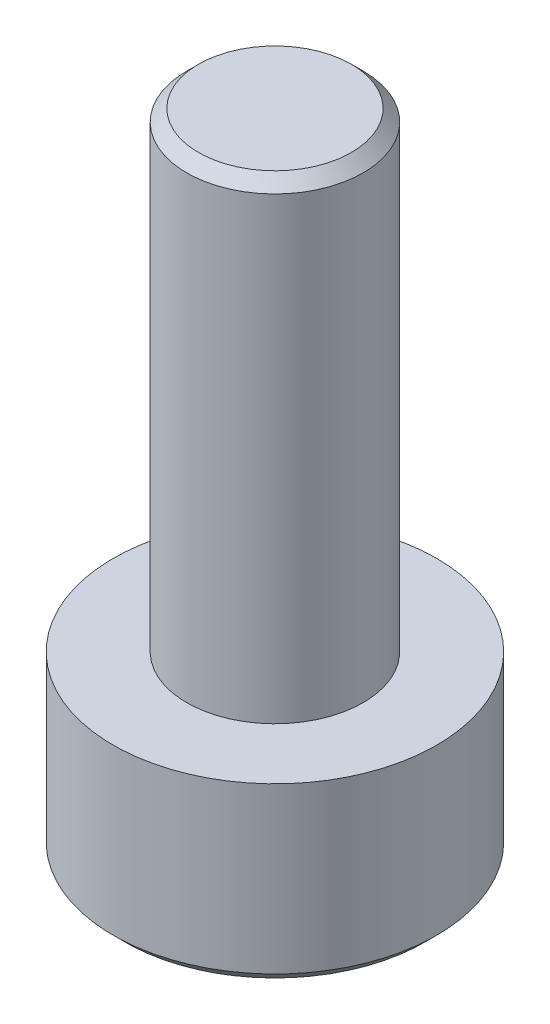
ISO-10303-21;
HEADER;
FILE_DESCRIPTION(('STEP AP214'),'2;1');
FILE_NAME('part.step','',(''),(''),'','','');
FILE_SCHEMA(('AUTOMOTIVE_DESIGN { 1 0 10303 214 1 1 1 1 }'));
ENDSEC;
DATA;
#1=APPLICATION_CONTEXT('core data for automotive mechanical design processes');
#2=APPLICATION_PROTOCOL_DEFINITION('international standard','automotive_design',2000,#1);
#3=PRODUCT_CONTEXT('',#1,'mechanical');
#4=PRODUCT('Part','Part','',(#3));
#5=PRODUCT_RELATED_PRODUCT_CATEGORY('part','',(#4));
#6=PRODUCT_DEFINITION_FORMATION('','',#4);
#7=PRODUCT_DEFINITION_CONTEXT('part definition',#1,'design');
#8=PRODUCT_DEFINITION('design','',#6,#7);
#9=PRODUCT_DEFINITION_SHAPE('','',#8);
#10=(LENGTH_UNIT() NAMED_UNIT(*) SI_UNIT(.MILLI.,.METRE.));
#11=(NAMED_UNIT(*) PLANE_ANGLE_UNIT() SI_UNIT($,.RADIAN.));
#12=(NAMED_UNIT(*) SI_UNIT($,.STERADIAN.) SOLID_ANGLE_UNIT());
#13=UNCERTAINTY_MEASURE_WITH_UNIT(LENGTH_MEASURE(1.E-05),#10,'distance_accuracy_value','');
#14=(GEOMETRIC_REPRESENTATION_CONTEXT(3) GLOBAL_UNCERTAINTY_ASSIGNED_CONTEXT((#13)) GLOBAL_UNIT_ASSIGNED_CONTEXT((#10,
#11,#12)) REPRESENTATION_CONTEXT('',''));
#15=CARTESIAN_POINT('',(0.,0.,0.));
#16=DIRECTION('',(0.,0.,1.));
#17=DIRECTION('',(1.,0.,0.));
#18=AXIS2_PLACEMENT_3D('',#15,#16,#17);
#19=CARTESIAN_POINT('',(0.,-3.,0.));
#20=DIRECTION('',(0.,-1.,0.));
#21=DIRECTION('',(0.,0.,-1.));
#22=AXIS2_PLACEMENT_3D('',#19,#20,#21);
#23=PLANE('',#22);
#24=CARTESIAN_POINT('',(0.,-3.,0.));
#25=DIRECTION('',(0.,-1.,0.));
#26=DIRECTION('',(0.,0.,-1.));
#27=AXIS2_PLACEMENT_3D('',#24,#25,#26);
#28=CIRCLE('',#27,2.55);
#29=CARTESIAN_POINT('',(0.,-3.,-2.55));
#30=VERTEX_POINT('',#29);
#31=EDGE_CURVE('E11',#30,#30,#28,.T.);
#32=ORIENTED_EDGE('',*,*,#31,.T.);
#33=EDGE_LOOP('',(#32));
#34=FACE_BOUND('',#33,.T.);
#35=DIRECTION('',(0.5,0.,-0.866025403784439));
#36=VECTOR('',#35,1.);
#37=CARTESIAN_POINT('',(1.44337567297406,-3.,0.));
#38=LINE('',#37,#36);
#39=CARTESIAN_POINT('',(0.721687836487032,-3.,1.25));
#40=VERTEX_POINT('',#39);
#41=CARTESIAN_POINT('',(1.44337567297406,-3.,0.));
#42=VERTEX_POINT('',#41);
#43=EDGE_CURVE('E131',#40,#42,#38,.T.);
#44=ORIENTED_EDGE('',*,*,#43,.T.);
#45=DIRECTION('',(-0.5,0.,-0.866025403784439));
#46=VECTOR('',#45,1.);
#47=CARTESIAN_POINT('',(0.721687836487032,-3.,-1.25));
#48=LINE('',#47,#46);
#49=CARTESIAN_POINT('',(0.721687836487032,-3.,-1.25));
#50=VERTEX_POINT('',#49);
#51=EDGE_CURVE('E51',#42,#50,#48,.T.);
#52=ORIENTED_EDGE('',*,*,#51,.T.);
#53=DIRECTION('',(-1.,0.,0.));
#54=VECTOR('',#53,1.);
#55=CARTESIAN_POINT('',(-0.721687836487033,-3.,-1.25));
#56=LINE('',#55,#54);
#57=CARTESIAN_POINT('',(-0.721687836487033,-3.,-1.25));
#58=VERTEX_POINT('',#57);
#59=EDGE_CURVE('E122',#50,#58,#56,.T.);
#60=ORIENTED_EDGE('',*,*,#59,.T.);
#61=DIRECTION('',(-0.5,0.,0.866025403784439));
#62=VECTOR('',#61,1.);
#63=CARTESIAN_POINT('',(-1.44337567297406,-3.,0.));
#64=LINE('',#63,#62);
#65=CARTESIAN_POINT('',(-1.44337567297406,-3.,0.));
#66=VERTEX_POINT('',#65);
#67=EDGE_CURVE('E125',#58,#66,#64,.T.);
#68=ORIENTED_EDGE('',*,*,#67,.T.);
#69=DIRECTION('',(0.5,0.,0.866025403784439));
#70=VECTOR('',#69,1.);
#71=CARTESIAN_POINT('',(-0.721687836487032,-3.,1.25));
#72=LINE('',#71,#70);
#73=CARTESIAN_POINT('',(-0.721687836487032,-3.,1.25));
#74=VERTEX_POINT('',#73);
#75=EDGE_CURVE('E128',#66,#74,#72,.T.);
#76=ORIENTED_EDGE('',*,*,#75,.T.);
#77=DIRECTION('',(1.,0.,0.));
#78=VECTOR('',#77,1.);
#79=CARTESIAN_POINT('',(0.721687836487032,-3.,1.25));
#80=LINE('',#79,#78);
#81=EDGE_CURVE('E112',#74,#40,#80,.T.);
#82=ORIENTED_EDGE('',*,*,#81,.T.);
#83=EDGE_LOOP('',(#44,#52,#60,#68,#76,#82));
#84=FACE_BOUND('',#83,.T.);
#85=ADVANCED_FACE('F37',(#34,#84),#23,.T.);
#86=CARTESIAN_POINT('',(0.,-3.,0.));
#87=DIRECTION('',(0.,1.,0.));
#88=DIRECTION('',(0.,0.,1.));
#89=AXIS2_PLACEMENT_3D('',#86,#87,#88);
#90=CONICAL_SURFACE('',#89,2.55,0.785398163397504);
#91=CARTESIAN_POINT('',(0.,-2.80000000000002,0.));
#92=DIRECTION('',(0.,-1.,0.));
#93=DIRECTION('',(0.,0.,-1.));
#94=AXIS2_PLACEMENT_3D('',#91,#92,#93);
#95=CIRCLE('',#94,2.75);
#96=CARTESIAN_POINT('',(0.,-2.80000000000002,-2.75));
#97=VERTEX_POINT('',#96);
#98=EDGE_CURVE('E44',#97,#97,#95,.T.);
#99=ORIENTED_EDGE('',*,*,#98,.T.);
#100=EDGE_LOOP('',(#99));
#101=FACE_BOUND('',#100,.T.);
#102=ORIENTED_EDGE('',*,*,#31,.F.);
#103=EDGE_LOOP('',(#102));
#104=FACE_BOUND('',#103,.T.);
#105=ADVANCED_FACE('F156',(#101,#104),#90,.T.);
#106=CARTESIAN_POINT('',(0.,-500.,0.));
#107=DIRECTION('',(0.,-1.,0.));
#108=DIRECTION('',(0.,0.,-1.));
#109=AXIS2_PLACEMENT_3D('',#106,#107,#108);
#110=CYLINDRICAL_SURFACE('',#109,2.75);
#111=CARTESIAN_POINT('',(0.,0.,0.));
#112=DIRECTION('',(0.,-1.,0.));
#113=DIRECTION('',(0.,0.,-1.));
#114=AXIS2_PLACEMENT_3D('',#111,#112,#113);
#115=CIRCLE('',#114,2.75);
#116=CARTESIAN_POINT('',(0.,0.,-2.75));
#117=VERTEX_POINT('',#116);
#118=EDGE_CURVE('E151',#117,#117,#115,.T.);
#119=ORIENTED_EDGE('',*,*,#118,.T.);
#120=EDGE_LOOP('',(#119));
#121=FACE_BOUND('',#120,.T.);
#122=ORIENTED_EDGE('',*,*,#98,.F.);
#123=EDGE_LOOP('',(#122));
#124=FACE_BOUND('',#123,.T.);
#125=ADVANCED_FACE('F159',(#121,#124),#110,.T.);
#126=CARTESIAN_POINT('',(2.75,0.,0.));
#127=DIRECTION('',(0.,1.,0.));
#128=DIRECTION('',(0.,0.,1.));
#129=AXIS2_PLACEMENT_3D('',#126,#127,#128);
#130=PLANE('',#129);
#131=CARTESIAN_POINT('',(0.,0.,0.));
#132=DIRECTION('',(0.,-1.,0.));
#133=DIRECTION('',(0.,0.,-1.));
#134=AXIS2_PLACEMENT_3D('',#131,#132,#133);
#135=CIRCLE('',#134,1.5);
#136=CARTESIAN_POINT('',(0.,0.,-1.5));
#137=VERTEX_POINT('',#136);
#138=EDGE_CURVE('E148',#137,#137,#135,.T.);
#139=ORIENTED_EDGE('',*,*,#138,.T.);
#140=EDGE_LOOP('',(#139));
#141=FACE_BOUND('',#140,.T.);
#142=ORIENTED_EDGE('',*,*,#118,.F.);
#143=EDGE_LOOP('',(#142));
#144=FACE_BOUND('',#143,.T.);
#145=ADVANCED_FACE('F161',(#141,#144),#130,.T.);
#146=CARTESIAN_POINT('',(0.,-500.,0.));
#147=DIRECTION('',(0.,-1.,0.));
#148=DIRECTION('',(0.,0.,-1.));
#149=AXIS2_PLACEMENT_3D('',#146,#147,#148);
#150=CYLINDRICAL_SURFACE('',#149,1.5);
#151=CARTESIAN_POINT('',(0.,7.80000000000003,0.));
#152=DIRECTION('',(0.,-1.,0.));
#153=DIRECTION('',(0.,0.,-1.));
#154=AXIS2_PLACEMENT_3D('',#151,#152,#153);
#155=CIRCLE('',#154,1.5);
#156=CARTESIAN_POINT('',(0.,7.80000000000003,-1.5));
#157=VERTEX_POINT('',#156);
#158=EDGE_CURVE('E145',#157,#157,#155,.T.);
#159=ORIENTED_EDGE('',*,*,#158,.T.);
#160=EDGE_LOOP('',(#159));
#161=FACE_BOUND('',#160,.T.);
#162=ORIENTED_EDGE('',*,*,#138,.F.);
#163=EDGE_LOOP('',(#162));
#164=FACE_BOUND('',#163,.T.);
#165=ADVANCED_FACE('F168',(#161,#164),#150,.T.);
#166=CARTESIAN_POINT('',(0.,7.80000000000003,0.));
#167=DIRECTION('',(0.,-1.,0.));
#168=DIRECTION('',(0.,0.,-1.));
#169=AXIS2_PLACEMENT_3D('',#166,#167,#168);
#170=CONICAL_SURFACE('',#169,1.5,0.785398163397504);
#171=CARTESIAN_POINT('',(0.,8.00000000000001,0.));
#172=DIRECTION('',(0.,-1.,0.));
#173=DIRECTION('',(0.,0.,-1.));
#174=AXIS2_PLACEMENT_3D('',#171,#172,#173);
#175=CIRCLE('',#174,1.3);
#176=CARTESIAN_POINT('',(0.,8.00000000000001,-1.3));
#177=VERTEX_POINT('',#176);
#178=EDGE_CURVE('E142',#177,#177,#175,.T.);
#179=ORIENTED_EDGE('',*,*,#178,.T.);
#180=EDGE_LOOP('',(#179));
#181=FACE_BOUND('',#180,.T.);
#182=ORIENTED_EDGE('',*,*,#158,.F.);
#183=EDGE_LOOP('',(#182));
#184=FACE_BOUND('',#183,.T.);
#185=ADVANCED_FACE('F201',(#181,#184),#170,.T.);
#186=CARTESIAN_POINT('',(1.3,8.,0.));
#187=DIRECTION('',(0.,1.,0.));
#188=DIRECTION('',(0.,0.,1.));
#189=AXIS2_PLACEMENT_3D('',#186,#187,#188);
#190=PLANE('',#189);
#191=ORIENTED_EDGE('',*,*,#178,.F.);
#192=EDGE_LOOP('',(#191));
#193=FACE_BOUND('',#192,.T.);
#194=ADVANCED_FACE('F195',(#193),#190,.T.);
#195=CARTESIAN_POINT('',(0.721687836487032,-1.5,-1.25));
#196=DIRECTION('',(-0.866025403784439,0.,0.5));
#197=DIRECTION('',(0.5,0.,0.866025403784439));
#198=AXIS2_PLACEMENT_3D('',#195,#196,#197);
#199=PLANE('',#198);
#200=ORIENTED_EDGE('',*,*,#51,.F.);
#201=DIRECTION('',(0.,-1.,0.));
#202=VECTOR('',#201,1.);
#203=CARTESIAN_POINT('',(1.44337567297406,-1.5,0.));
#204=LINE('',#203,#202);
#205=CARTESIAN_POINT('',(1.44337567297406,-1.5,0.));
#206=VERTEX_POINT('',#205);
#207=EDGE_CURVE('E117',#206,#42,#204,.T.);
#208=ORIENTED_EDGE('',*,*,#207,.F.);
#209=DIRECTION('',(-0.5,0.,-0.866025403784439));
#210=VECTOR('',#209,1.);
#211=CARTESIAN_POINT('',(0.721687836487032,-1.5,-1.25));
#212=LINE('',#211,#210);
#213=CARTESIAN_POINT('',(0.721687836487032,-1.5,-1.25));
#214=VERTEX_POINT('',#213);
#215=EDGE_CURVE('E134',#206,#214,#212,.T.);
#216=ORIENTED_EDGE('',*,*,#215,.T.);
#217=DIRECTION('',(0.,-1.,0.));
#218=VECTOR('',#217,1.);
#219=CARTESIAN_POINT('',(0.721687836487032,-1.5,-1.25));
#220=LINE('',#219,#218);
#221=EDGE_CURVE('E140',#214,#50,#220,.T.);
#222=ORIENTED_EDGE('',*,*,#221,.T.);
#223=EDGE_LOOP('',(#200,#208,#216,#222));
#224=FACE_BOUND('',#223,.T.);
#225=ADVANCED_FACE('F178',(#224),#199,.T.);
#226=CARTESIAN_POINT('',(-0.721687836487033,-1.5,-1.25));
#227=DIRECTION('',(0.,0.,1.));
#228=DIRECTION('',(1.,0.,0.));
#229=AXIS2_PLACEMENT_3D('',#226,#227,#228);
#230=PLANE('',#229);
#231=ORIENTED_EDGE('',*,*,#59,.F.);
#232=ORIENTED_EDGE('',*,*,#221,.F.);
#233=DIRECTION('',(-1.,0.,0.));
#234=VECTOR('',#233,1.);
#235=CARTESIAN_POINT('',(-0.721687836487033,-1.5,-1.25));
#236=LINE('',#235,#234);
#237=CARTESIAN_POINT('',(-0.721687836487033,-1.5,-1.25));
#238=VERTEX_POINT('',#237);
#239=EDGE_CURVE('E90',#214,#238,#236,.T.);
#240=ORIENTED_EDGE('',*,*,#239,.T.);
#241=DIRECTION('',(0.,-1.,0.));
#242=VECTOR('',#241,1.);
#243=CARTESIAN_POINT('',(-0.721687836487033,-1.5,-1.25));
#244=LINE('',#243,#242);
#245=EDGE_CURVE('E138',#238,#58,#244,.T.);
#246=ORIENTED_EDGE('',*,*,#245,.T.);
#247=EDGE_LOOP('',(#231,#232,#240,#246));
#248=FACE_BOUND('',#247,.T.);
#249=ADVANCED_FACE('F187',(#248),#230,.T.);
#250=CARTESIAN_POINT('',(-1.44337567297406,-1.5,0.));
#251=DIRECTION('',(0.866025403784439,0.,0.5));
#252=DIRECTION('',(0.5,0.,-0.866025403784439));
#253=AXIS2_PLACEMENT_3D('',#250,#251,#252);
#254=PLANE('',#253);
#255=ORIENTED_EDGE('',*,*,#67,.F.);
#256=ORIENTED_EDGE('',*,*,#245,.F.);
#257=DIRECTION('',(-0.5,0.,0.866025403784439));
#258=VECTOR('',#257,1.);
#259=CARTESIAN_POINT('',(-1.44337567297406,-1.5,0.));
#260=LINE('',#259,#258);
#261=CARTESIAN_POINT('',(-1.44337567297406,-1.5,0.));
#262=VERTEX_POINT('',#261);
#263=EDGE_CURVE('E108',#238,#262,#260,.T.);
#264=ORIENTED_EDGE('',*,*,#263,.T.);
#265=DIRECTION('',(0.,-1.,0.));
#266=VECTOR('',#265,1.);
#267=CARTESIAN_POINT('',(-1.44337567297406,-1.5,0.));
#268=LINE('',#267,#266);
#269=EDGE_CURVE('E105',#262,#66,#268,.T.);
#270=ORIENTED_EDGE('',*,*,#269,.T.);
#271=EDGE_LOOP('',(#255,#256,#264,#270));
#272=FACE_BOUND('',#271,.T.);
#273=ADVANCED_FACE('F185',(#272),#254,.T.);
#274=CARTESIAN_POINT('',(-0.721687836487032,-1.5,1.25));
#275=DIRECTION('',(0.866025403784438,0.,-0.5));
#276=DIRECTION('',(-0.5,0.,-0.866025403784439));
#277=AXIS2_PLACEMENT_3D('',#274,#275,#276);
#278=PLANE('',#277);
#279=ORIENTED_EDGE('',*,*,#75,.F.);
#280=ORIENTED_EDGE('',*,*,#269,.F.);
#281=DIRECTION('',(0.5,0.,0.866025403784439));
#282=VECTOR('',#281,1.);
#283=CARTESIAN_POINT('',(-0.721687836487032,-1.5,1.25));
#284=LINE('',#283,#282);
#285=CARTESIAN_POINT('',(-0.721687836487032,-1.5,1.25));
#286=VERTEX_POINT('',#285);
#287=EDGE_CURVE('E100',#262,#286,#284,.T.);
#288=ORIENTED_EDGE('',*,*,#287,.T.);
#289=DIRECTION('',(0.,-1.,0.));
#290=VECTOR('',#289,1.);
#291=CARTESIAN_POINT('',(-0.721687836487032,-1.5,1.25));
#292=LINE('',#291,#290);
#293=EDGE_CURVE('E104',#286,#74,#292,.T.);
#294=ORIENTED_EDGE('',*,*,#293,.T.);
#295=EDGE_LOOP('',(#279,#280,#288,#294));
#296=FACE_BOUND('',#295,.T.);
#297=ADVANCED_FACE('F103',(#296),#278,.T.);
#298=CARTESIAN_POINT('',(0.721687836487032,-1.5,1.25));
#299=DIRECTION('',(0.,0.,-1.));
#300=DIRECTION('',(-1.,0.,0.));
#301=AXIS2_PLACEMENT_3D('',#298,#299,#300);
#302=PLANE('',#301);
#303=ORIENTED_EDGE('',*,*,#81,.F.);
#304=ORIENTED_EDGE('',*,*,#293,.F.);
#305=DIRECTION('',(1.,0.,0.));
#306=VECTOR('',#305,1.);
#307=CARTESIAN_POINT('',(0.721687836487032,-1.5,1.25));
#308=LINE('',#307,#306);
#309=CARTESIAN_POINT('',(0.721687836487032,-1.5,1.25));
#310=VERTEX_POINT('',#309);
#311=EDGE_CURVE('E107',#286,#310,#308,.T.);
#312=ORIENTED_EDGE('',*,*,#311,.T.);
#313=DIRECTION('',(0.,-1.,0.));
#314=VECTOR('',#313,1.);
#315=CARTESIAN_POINT('',(0.721687836487032,-1.5,1.25));
#316=LINE('',#315,#314);
#317=EDGE_CURVE('E81',#310,#40,#316,.T.);
#318=ORIENTED_EDGE('',*,*,#317,.T.);
#319=EDGE_LOOP('',(#303,#304,#312,#318));
#320=FACE_BOUND('',#319,.T.);
#321=ADVANCED_FACE('F110',(#320),#302,.T.);
#322=CARTESIAN_POINT('',(1.44337567297406,-1.5,0.));
#323=DIRECTION('',(-0.866025403784439,0.,-0.5));
#324=DIRECTION('',(-0.5,0.,0.866025403784439));
#325=AXIS2_PLACEMENT_3D('',#322,#323,#324);
#326=PLANE('',#325);
#327=ORIENTED_EDGE('',*,*,#43,.F.);
#328=ORIENTED_EDGE('',*,*,#317,.F.);
#329=DIRECTION('',(0.5,0.,-0.866025403784439));
#330=VECTOR('',#329,1.);
#331=CARTESIAN_POINT('',(1.44337567297406,-1.5,0.));
#332=LINE('',#331,#330);
#333=EDGE_CURVE('E59',#310,#206,#332,.T.);
#334=ORIENTED_EDGE('',*,*,#333,.T.);
#335=ORIENTED_EDGE('',*,*,#207,.T.);
#336=EDGE_LOOP('',(#327,#328,#334,#335));
#337=FACE_BOUND('',#336,.T.);
#338=ADVANCED_FACE('F177',(#337),#326,.T.);
#339=CARTESIAN_POINT('',(0.,-1.5,0.));
#340=DIRECTION('',(0.,-1.,0.));
#341=DIRECTION('',(0.,0.,-1.));
#342=AXIS2_PLACEMENT_3D('',#339,#340,#341);
#343=PLANE('',#342);
#344=ORIENTED_EDGE('',*,*,#215,.F.);
#345=ORIENTED_EDGE('',*,*,#333,.F.);
#346=ORIENTED_EDGE('',*,*,#311,.F.);
#347=ORIENTED_EDGE('',*,*,#287,.F.);
#348=ORIENTED_EDGE('',*,*,#263,.F.);
#349=ORIENTED_EDGE('',*,*,#239,.F.);
#350=EDGE_LOOP('',(#344,#345,#346,#347,#348,#349));
#351=FACE_BOUND('',#350,.T.);
#352=ADVANCED_FACE('F115',(#351),#343,.T.);
#353=CLOSED_SHELL('',(#85,#105,#125,#145,#165,#185,#194,#225,#249,#273,#297,#321,#338,#352));
#354=MANIFOLD_SOLID_BREP('B2',#353);
#355=ADVANCED_BREP_SHAPE_REPRESENTATION('',(#18,#354),#14);
#356=SHAPE_DEFINITION_REPRESENTATION(#9,#355);
ENDSEC;
END-ISO-10303-21;
